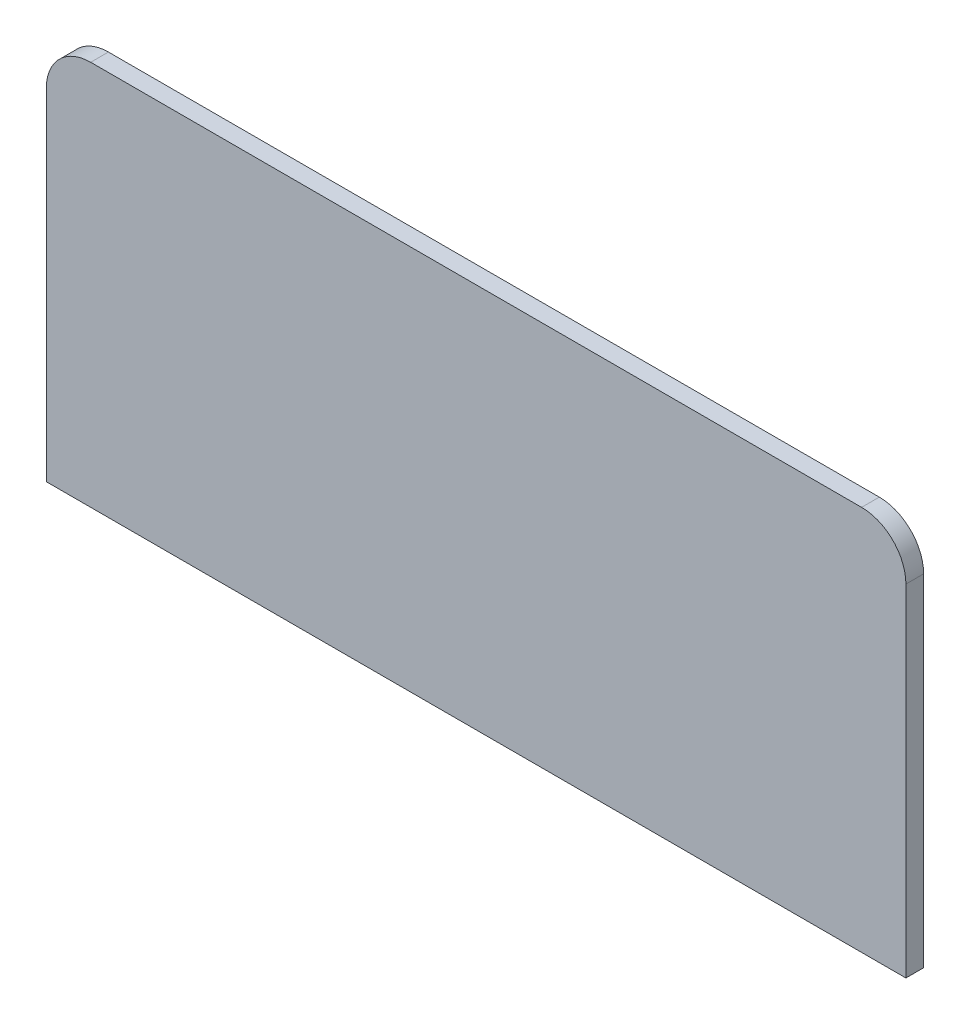
ISO-10303-21;
HEADER;
FILE_DESCRIPTION(('STEP AP214'),'2;1');
FILE_NAME('part.step','',(''),(''),'','','');
FILE_SCHEMA(('AUTOMOTIVE_DESIGN { 1 0 10303 214 1 1 1 1 }'));
ENDSEC;
DATA;
#1=APPLICATION_CONTEXT('core data for automotive mechanical design processes');
#2=APPLICATION_PROTOCOL_DEFINITION('international standard','automotive_design',2000,#1);
#3=PRODUCT_CONTEXT('',#1,'mechanical');
#4=PRODUCT('Part','Part','',(#3));
#5=PRODUCT_RELATED_PRODUCT_CATEGORY('part','',(#4));
#6=PRODUCT_DEFINITION_FORMATION('','',#4);
#7=PRODUCT_DEFINITION_CONTEXT('part definition',#1,'design');
#8=PRODUCT_DEFINITION('design','',#6,#7);
#9=PRODUCT_DEFINITION_SHAPE('','',#8);
#10=(LENGTH_UNIT() NAMED_UNIT(*) SI_UNIT(.MILLI.,.METRE.));
#11=(NAMED_UNIT(*) PLANE_ANGLE_UNIT() SI_UNIT($,.RADIAN.));
#12=(NAMED_UNIT(*) SI_UNIT($,.STERADIAN.) SOLID_ANGLE_UNIT());
#13=UNCERTAINTY_MEASURE_WITH_UNIT(LENGTH_MEASURE(1.E-05),#10,'distance_accuracy_value','');
#14=(GEOMETRIC_REPRESENTATION_CONTEXT(3) GLOBAL_UNCERTAINTY_ASSIGNED_CONTEXT((#13)) GLOBAL_UNIT_ASSIGNED_CONTEXT((#10,
#11,#12)) REPRESENTATION_CONTEXT('',''));
#15=CARTESIAN_POINT('',(0.,0.,0.));
#16=DIRECTION('',(0.,0.,1.));
#17=DIRECTION('',(1.,0.,0.));
#18=AXIS2_PLACEMENT_3D('',#15,#16,#17);
#19=CARTESIAN_POINT('',(97.,-43.5,4.));
#20=DIRECTION('',(-1.,0.,0.));
#21=DIRECTION('',(0.,0.,1.));
#22=AXIS2_PLACEMENT_3D('',#19,#20,#21);
#23=PLANE('',#22);
#24=DIRECTION('',(0.,1.,0.));
#25=VECTOR('',#24,1.);
#26=CARTESIAN_POINT('',(97.,-43.5,0.));
#27=LINE('',#26,#25);
#28=CARTESIAN_POINT('',(97.,-43.5,0.));
#29=VERTEX_POINT('',#28);
#30=CARTESIAN_POINT('',(97.,33.5,0.));
#31=VERTEX_POINT('',#30);
#32=EDGE_CURVE('E123',#29,#31,#27,.T.);
#33=ORIENTED_EDGE('',*,*,#32,.T.);
#34=DIRECTION('',(0.,0.,-1.));
#35=VECTOR('',#34,1.);
#36=CARTESIAN_POINT('',(97.,33.5,4.));
#37=LINE('',#36,#35);
#38=CARTESIAN_POINT('',(97.,33.5,4.));
#39=VERTEX_POINT('',#38);
#40=EDGE_CURVE('E11',#31,#39,#37,.F.);
#41=ORIENTED_EDGE('',*,*,#40,.T.);
#42=DIRECTION('',(0.,1.,0.));
#43=VECTOR('',#42,1.);
#44=CARTESIAN_POINT('',(97.,-43.5,4.));
#45=LINE('',#44,#43);
#46=CARTESIAN_POINT('',(97.,-43.5,4.));
#47=VERTEX_POINT('',#46);
#48=EDGE_CURVE('E129',#47,#39,#45,.T.);
#49=ORIENTED_EDGE('',*,*,#48,.F.);
#50=DIRECTION('',(0.,0.,-1.));
#51=VECTOR('',#50,1.);
#52=CARTESIAN_POINT('',(97.,-43.5,4.));
#53=LINE('',#52,#51);
#54=EDGE_CURVE('E115',#47,#29,#53,.T.);
#55=ORIENTED_EDGE('',*,*,#54,.T.);
#56=EDGE_LOOP('',(#33,#41,#49,#55));
#57=FACE_BOUND('',#56,.T.);
#58=ADVANCED_FACE('F41',(#57),#23,.F.);
#59=CARTESIAN_POINT('',(-97.,43.5,4.));
#60=DIRECTION('',(0.,-1.,0.));
#61=DIRECTION('',(0.,0.,-1.));
#62=AXIS2_PLACEMENT_3D('',#59,#60,#61);
#63=PLANE('',#62);
#64=DIRECTION('',(-1.,0.,0.));
#65=VECTOR('',#64,1.);
#66=CARTESIAN_POINT('',(-97.,43.5,0.));
#67=LINE('',#66,#65);
#68=CARTESIAN_POINT('',(86.9999999999999,43.5,0.));
#69=VERTEX_POINT('',#68);
#70=CARTESIAN_POINT('',(-87.,43.5,0.));
#71=VERTEX_POINT('',#70);
#72=EDGE_CURVE('E125',#69,#71,#67,.T.);
#73=ORIENTED_EDGE('',*,*,#72,.T.);
#74=DIRECTION('',(0.,0.,-1.));
#75=VECTOR('',#74,1.);
#76=CARTESIAN_POINT('',(-87.,43.5,4.));
#77=LINE('',#76,#75);
#78=CARTESIAN_POINT('',(-87.,43.5,4.));
#79=VERTEX_POINT('',#78);
#80=EDGE_CURVE('E62',#71,#79,#77,.F.);
#81=ORIENTED_EDGE('',*,*,#80,.T.);
#82=DIRECTION('',(-1.,0.,0.));
#83=VECTOR('',#82,1.);
#84=CARTESIAN_POINT('',(-97.,43.5,4.));
#85=LINE('',#84,#83);
#86=CARTESIAN_POINT('',(86.9999999999999,43.5,4.));
#87=VERTEX_POINT('',#86);
#88=EDGE_CURVE('E105',#87,#79,#85,.T.);
#89=ORIENTED_EDGE('',*,*,#88,.F.);
#90=DIRECTION('',(0.,0.,-1.));
#91=VECTOR('',#90,1.);
#92=CARTESIAN_POINT('',(87.,43.5,4.));
#93=LINE('',#92,#91);
#94=EDGE_CURVE('E136',#87,#69,#93,.T.);
#95=ORIENTED_EDGE('',*,*,#94,.T.);
#96=EDGE_LOOP('',(#73,#81,#89,#95));
#97=FACE_BOUND('',#96,.T.);
#98=ADVANCED_FACE('F144',(#97),#63,.F.);
#99=CARTESIAN_POINT('',(-97.,-43.5,4.));
#100=DIRECTION('',(1.,0.,0.));
#101=DIRECTION('',(0.,0.,-1.));
#102=AXIS2_PLACEMENT_3D('',#99,#100,#101);
#103=PLANE('',#102);
#104=DIRECTION('',(0.,-1.,0.));
#105=VECTOR('',#104,1.);
#106=CARTESIAN_POINT('',(-97.,-43.5,4.));
#107=LINE('',#106,#105);
#108=CARTESIAN_POINT('',(-97.,33.5,4.));
#109=VERTEX_POINT('',#108);
#110=CARTESIAN_POINT('',(-97.,-43.5,4.));
#111=VERTEX_POINT('',#110);
#112=EDGE_CURVE('E95',#109,#111,#107,.T.);
#113=ORIENTED_EDGE('',*,*,#112,.F.);
#114=DIRECTION('',(0.,0.,-1.));
#115=VECTOR('',#114,1.);
#116=CARTESIAN_POINT('',(-97.,33.5,4.));
#117=LINE('',#116,#115);
#118=CARTESIAN_POINT('',(-97.,33.5,0.));
#119=VERTEX_POINT('',#118);
#120=EDGE_CURVE('E114',#109,#119,#117,.T.);
#121=ORIENTED_EDGE('',*,*,#120,.T.);
#122=DIRECTION('',(0.,-1.,0.));
#123=VECTOR('',#122,1.);
#124=CARTESIAN_POINT('',(-97.,-43.5,0.));
#125=LINE('',#124,#123);
#126=CARTESIAN_POINT('',(-97.,-43.5,0.));
#127=VERTEX_POINT('',#126);
#128=EDGE_CURVE('E111',#119,#127,#125,.T.);
#129=ORIENTED_EDGE('',*,*,#128,.T.);
#130=DIRECTION('',(0.,0.,-1.));
#131=VECTOR('',#130,1.);
#132=CARTESIAN_POINT('',(-97.,-43.5,4.));
#133=LINE('',#132,#131);
#134=EDGE_CURVE('E108',#111,#127,#133,.T.);
#135=ORIENTED_EDGE('',*,*,#134,.F.);
#136=EDGE_LOOP('',(#113,#121,#129,#135));
#137=FACE_BOUND('',#136,.T.);
#138=ADVANCED_FACE('F109',(#137),#103,.F.);
#139=CARTESIAN_POINT('',(-97.,-43.5,4.));
#140=DIRECTION('',(0.,1.,0.));
#141=DIRECTION('',(0.,0.,1.));
#142=AXIS2_PLACEMENT_3D('',#139,#140,#141);
#143=PLANE('',#142);
#144=DIRECTION('',(1.,0.,0.));
#145=VECTOR('',#144,1.);
#146=CARTESIAN_POINT('',(-97.,-43.5,0.));
#147=LINE('',#146,#145);
#148=EDGE_CURVE('E128',#127,#29,#147,.T.);
#149=ORIENTED_EDGE('',*,*,#148,.T.);
#150=ORIENTED_EDGE('',*,*,#54,.F.);
#151=DIRECTION('',(1.,0.,0.));
#152=VECTOR('',#151,1.);
#153=CARTESIAN_POINT('',(-97.,-43.5,4.));
#154=LINE('',#153,#152);
#155=EDGE_CURVE('E99',#111,#47,#154,.T.);
#156=ORIENTED_EDGE('',*,*,#155,.F.);
#157=ORIENTED_EDGE('',*,*,#134,.T.);
#158=EDGE_LOOP('',(#149,#150,#156,#157));
#159=FACE_BOUND('',#158,.T.);
#160=ADVANCED_FACE('F117',(#159),#143,.F.);
#161=CARTESIAN_POINT('',(0.,0.,4.));
#162=DIRECTION('',(0.,0.,-1.));
#163=DIRECTION('',(-1.,0.,0.));
#164=AXIS2_PLACEMENT_3D('',#161,#162,#163);
#165=PLANE('',#164);
#166=ORIENTED_EDGE('',*,*,#88,.T.);
#167=CARTESIAN_POINT('',(-87.,33.5,4.));
#168=DIRECTION('',(0.,0.,-1.));
#169=DIRECTION('',(-1.,0.,0.));
#170=AXIS2_PLACEMENT_3D('',#167,#168,#169);
#171=CIRCLE('',#170,10.);
#172=EDGE_CURVE('E49',#79,#109,#171,.F.);
#173=ORIENTED_EDGE('',*,*,#172,.T.);
#174=ORIENTED_EDGE('',*,*,#112,.T.);
#175=ORIENTED_EDGE('',*,*,#155,.T.);
#176=ORIENTED_EDGE('',*,*,#48,.T.);
#177=CARTESIAN_POINT('',(87.,33.5,4.));
#178=DIRECTION('',(0.,0.,-1.));
#179=DIRECTION('',(-1.,0.,0.));
#180=AXIS2_PLACEMENT_3D('',#177,#178,#179);
#181=CIRCLE('',#180,10.);
#182=EDGE_CURVE('E140',#39,#87,#181,.F.);
#183=ORIENTED_EDGE('',*,*,#182,.T.);
#184=EDGE_LOOP('',(#166,#173,#174,#175,#176,#183));
#185=FACE_BOUND('',#184,.T.);
#186=ADVANCED_FACE('F97',(#185),#165,.F.);
#187=CARTESIAN_POINT('',(0.,0.,0.));
#188=DIRECTION('',(0.,0.,-1.));
#189=DIRECTION('',(-1.,0.,0.));
#190=AXIS2_PLACEMENT_3D('',#187,#188,#189);
#191=PLANE('',#190);
#192=ORIENTED_EDGE('',*,*,#128,.F.);
#193=CARTESIAN_POINT('',(-87.,33.5,0.));
#194=DIRECTION('',(0.,0.,-1.));
#195=DIRECTION('',(-1.,0.,0.));
#196=AXIS2_PLACEMENT_3D('',#193,#194,#195);
#197=CIRCLE('',#196,10.);
#198=EDGE_CURVE('E134',#119,#71,#197,.T.);
#199=ORIENTED_EDGE('',*,*,#198,.T.);
#200=ORIENTED_EDGE('',*,*,#72,.F.);
#201=CARTESIAN_POINT('',(87.,33.5,0.));
#202=DIRECTION('',(0.,0.,-1.));
#203=DIRECTION('',(-1.,0.,0.));
#204=AXIS2_PLACEMENT_3D('',#201,#202,#203);
#205=CIRCLE('',#204,10.);
#206=EDGE_CURVE('E132',#69,#31,#205,.T.);
#207=ORIENTED_EDGE('',*,*,#206,.T.);
#208=ORIENTED_EDGE('',*,*,#32,.F.);
#209=ORIENTED_EDGE('',*,*,#148,.F.);
#210=EDGE_LOOP('',(#192,#199,#200,#207,#208,#209));
#211=FACE_BOUND('',#210,.T.);
#212=ADVANCED_FACE('F148',(#211),#191,.T.);
#213=CARTESIAN_POINT('',(-87.,33.5,4.));
#214=DIRECTION('',(0.,0.,-1.));
#215=DIRECTION('',(-1.,0.,0.));
#216=AXIS2_PLACEMENT_3D('',#213,#214,#215);
#217=CYLINDRICAL_SURFACE('',#216,10.);
#218=ORIENTED_EDGE('',*,*,#172,.F.);
#219=ORIENTED_EDGE('',*,*,#80,.F.);
#220=ORIENTED_EDGE('',*,*,#198,.F.);
#221=ORIENTED_EDGE('',*,*,#120,.F.);
#222=EDGE_LOOP('',(#218,#219,#220,#221));
#223=FACE_BOUND('',#222,.T.);
#224=ADVANCED_FACE('F158',(#223),#217,.T.);
#225=CARTESIAN_POINT('',(87.,33.5,4.));
#226=DIRECTION('',(0.,0.,-1.));
#227=DIRECTION('',(-1.,0.,0.));
#228=AXIS2_PLACEMENT_3D('',#225,#226,#227);
#229=CYLINDRICAL_SURFACE('',#228,10.);
#230=ORIENTED_EDGE('',*,*,#182,.F.);
#231=ORIENTED_EDGE('',*,*,#40,.F.);
#232=ORIENTED_EDGE('',*,*,#206,.F.);
#233=ORIENTED_EDGE('',*,*,#94,.F.);
#234=EDGE_LOOP('',(#230,#231,#232,#233));
#235=FACE_BOUND('',#234,.T.);
#236=ADVANCED_FACE('F43',(#235),#229,.T.);
#237=CLOSED_SHELL('',(#58,#98,#138,#160,#186,#212,#224,#236));
#238=MANIFOLD_SOLID_BREP('B2',#237);
#239=ADVANCED_BREP_SHAPE_REPRESENTATION('',(#18,#238),#14);
#240=SHAPE_DEFINITION_REPRESENTATION(#9,#239);
ENDSEC;
END-ISO-10303-21;
